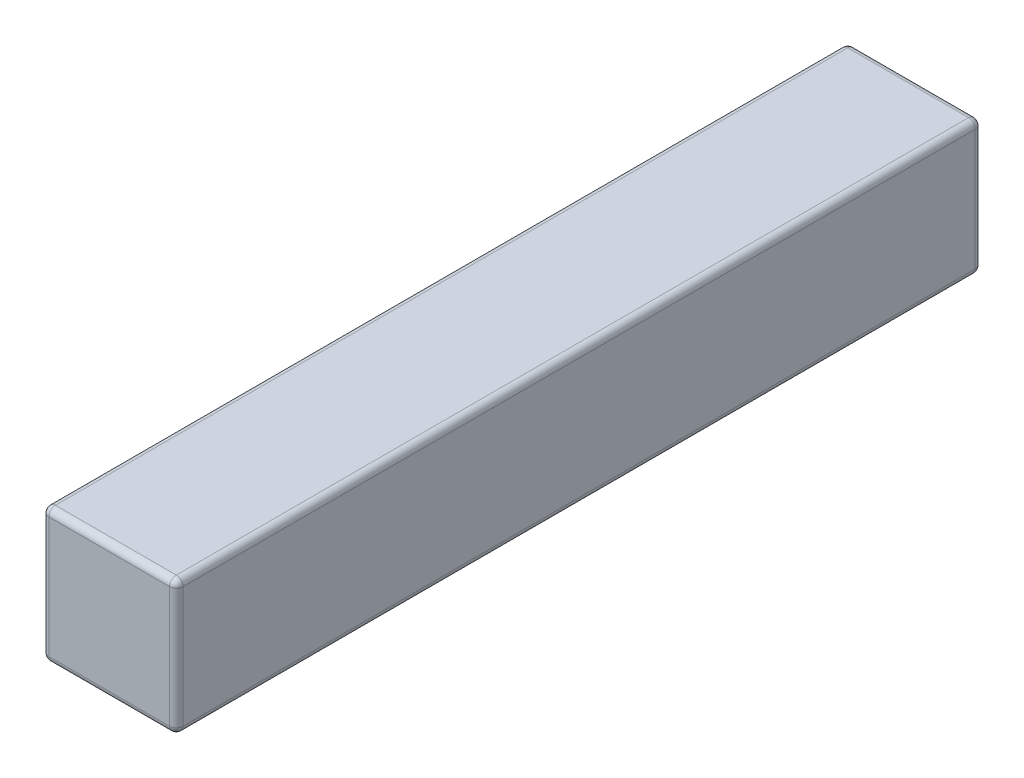
ISO-10303-21;
HEADER;
FILE_DESCRIPTION(('STEP AP214'),'2;1');
FILE_NAME('part.step','',(''),(''),'','','');
FILE_SCHEMA(('AUTOMOTIVE_DESIGN { 1 0 10303 214 1 1 1 1 }'));
ENDSEC;
DATA;
#1=APPLICATION_CONTEXT('core data for automotive mechanical design processes');
#2=APPLICATION_PROTOCOL_DEFINITION('international standard','automotive_design',2000,#1);
#3=PRODUCT_CONTEXT('',#1,'mechanical');
#4=PRODUCT('Part','Part','',(#3));
#5=PRODUCT_RELATED_PRODUCT_CATEGORY('part','',(#4));
#6=PRODUCT_DEFINITION_FORMATION('','',#4);
#7=PRODUCT_DEFINITION_CONTEXT('part definition',#1,'design');
#8=PRODUCT_DEFINITION('design','',#6,#7);
#9=PRODUCT_DEFINITION_SHAPE('','',#8);
#10=(LENGTH_UNIT() NAMED_UNIT(*) SI_UNIT(.MILLI.,.METRE.));
#11=(NAMED_UNIT(*) PLANE_ANGLE_UNIT() SI_UNIT($,.RADIAN.));
#12=(NAMED_UNIT(*) SI_UNIT($,.STERADIAN.) SOLID_ANGLE_UNIT());
#13=UNCERTAINTY_MEASURE_WITH_UNIT(LENGTH_MEASURE(1.E-05),#10,'distance_accuracy_value','');
#14=(GEOMETRIC_REPRESENTATION_CONTEXT(3) GLOBAL_UNCERTAINTY_ASSIGNED_CONTEXT((#13)) GLOBAL_UNIT_ASSIGNED_CONTEXT((#10,
#11,#12)) REPRESENTATION_CONTEXT('',''));
#15=CARTESIAN_POINT('',(0.,0.,0.));
#16=DIRECTION('',(0.,0.,1.));
#17=DIRECTION('',(1.,0.,0.));
#18=AXIS2_PLACEMENT_3D('',#15,#16,#17);
#19=CARTESIAN_POINT('',(0.,0.,304.8));
#20=DIRECTION('',(1.,0.,0.));
#21=DIRECTION('',(0.,0.,-1.));
#22=AXIS2_PLACEMENT_3D('',#19,#20,#21);
#23=PLANE('',#22);
#24=DIRECTION('',(0.,0.,-1.));
#25=VECTOR('',#24,1.);
#26=CARTESIAN_POINT('',(0.,48.26,304.8));
#27=LINE('',#26,#25);
#28=CARTESIAN_POINT('',(0.,48.26,302.26));
#29=VERTEX_POINT('',#28);
#30=CARTESIAN_POINT('',(0.,48.26,2.53999999999999));
#31=VERTEX_POINT('',#30);
#32=EDGE_CURVE('E383',#29,#31,#27,.T.);
#33=ORIENTED_EDGE('',*,*,#32,.T.);
#34=DIRECTION('',(0.,-1.,0.));
#35=VECTOR('',#34,1.);
#36=CARTESIAN_POINT('',(0.,0.,2.53999999999999));
#37=LINE('',#36,#35);
#38=CARTESIAN_POINT('',(0.,2.54,2.53999999999999));
#39=VERTEX_POINT('',#38);
#40=EDGE_CURVE('E389',#31,#39,#37,.T.);
#41=ORIENTED_EDGE('',*,*,#40,.T.);
#42=DIRECTION('',(0.,0.,-1.));
#43=VECTOR('',#42,1.);
#44=CARTESIAN_POINT('',(0.,2.54,304.8));
#45=LINE('',#44,#43);
#46=CARTESIAN_POINT('',(0.,2.54,302.26));
#47=VERTEX_POINT('',#46);
#48=EDGE_CURVE('E387',#39,#47,#45,.F.);
#49=ORIENTED_EDGE('',*,*,#48,.T.);
#50=DIRECTION('',(0.,-1.,0.));
#51=VECTOR('',#50,1.);
#52=CARTESIAN_POINT('',(0.,0.,302.26));
#53=LINE('',#52,#51);
#54=EDGE_CURVE('E385',#47,#29,#53,.F.);
#55=ORIENTED_EDGE('',*,*,#54,.T.);
#56=EDGE_LOOP('',(#33,#41,#49,#55));
#57=FACE_BOUND('',#56,.T.);
#58=ADVANCED_FACE('F35',(#57),#23,.F.);
#59=CARTESIAN_POINT('',(0.,0.,304.8));
#60=DIRECTION('',(0.,1.,0.));
#61=DIRECTION('',(0.,0.,1.));
#62=AXIS2_PLACEMENT_3D('',#59,#60,#61);
#63=PLANE('',#62);
#64=DIRECTION('',(0.,0.,-1.));
#65=VECTOR('',#64,1.);
#66=CARTESIAN_POINT('',(2.54,0.,304.8));
#67=LINE('',#66,#65);
#68=CARTESIAN_POINT('',(2.54,0.,302.26));
#69=VERTEX_POINT('',#68);
#70=CARTESIAN_POINT('',(2.54,0.,2.53999999999999));
#71=VERTEX_POINT('',#70);
#72=EDGE_CURVE('E378',#69,#71,#67,.T.);
#73=ORIENTED_EDGE('',*,*,#72,.T.);
#74=DIRECTION('',(1.,0.,0.));
#75=VECTOR('',#74,1.);
#76=CARTESIAN_POINT('',(50.8,0.,2.53999999999999));
#77=LINE('',#76,#75);
#78=CARTESIAN_POINT('',(48.26,0.,2.53999999999999));
#79=VERTEX_POINT('',#78);
#80=EDGE_CURVE('E380',#71,#79,#77,.T.);
#81=ORIENTED_EDGE('',*,*,#80,.T.);
#82=DIRECTION('',(0.,0.,-1.));
#83=VECTOR('',#82,1.);
#84=CARTESIAN_POINT('',(48.26,0.,304.8));
#85=LINE('',#84,#83);
#86=CARTESIAN_POINT('',(48.26,0.,302.26));
#87=VERTEX_POINT('',#86);
#88=EDGE_CURVE('E376',#79,#87,#85,.F.);
#89=ORIENTED_EDGE('',*,*,#88,.T.);
#90=DIRECTION('',(1.,0.,0.));
#91=VECTOR('',#90,1.);
#92=CARTESIAN_POINT('',(0.,0.,302.26));
#93=LINE('',#92,#91);
#94=EDGE_CURVE('E374',#87,#69,#93,.F.);
#95=ORIENTED_EDGE('',*,*,#94,.T.);
#96=EDGE_LOOP('',(#73,#81,#89,#95));
#97=FACE_BOUND('',#96,.T.);
#98=ADVANCED_FACE('F487',(#97),#63,.F.);
#99=CARTESIAN_POINT('',(50.8,0.,304.8));
#100=DIRECTION('',(-1.,0.,0.));
#101=DIRECTION('',(0.,0.,1.));
#102=AXIS2_PLACEMENT_3D('',#99,#100,#101);
#103=PLANE('',#102);
#104=DIRECTION('',(0.,0.,-1.));
#105=VECTOR('',#104,1.);
#106=CARTESIAN_POINT('',(50.8,2.54,304.8));
#107=LINE('',#106,#105);
#108=CARTESIAN_POINT('',(50.8,2.54,302.26));
#109=VERTEX_POINT('',#108);
#110=CARTESIAN_POINT('',(50.8,2.54,2.53999999999999));
#111=VERTEX_POINT('',#110);
#112=EDGE_CURVE('E360',#109,#111,#107,.T.);
#113=ORIENTED_EDGE('',*,*,#112,.T.);
#114=DIRECTION('',(0.,1.,0.));
#115=VECTOR('',#114,1.);
#116=CARTESIAN_POINT('',(50.8,50.8,2.53999999999999));
#117=LINE('',#116,#115);
#118=CARTESIAN_POINT('',(50.8,48.26,2.53999999999999));
#119=VERTEX_POINT('',#118);
#120=EDGE_CURVE('E362',#111,#119,#117,.T.);
#121=ORIENTED_EDGE('',*,*,#120,.T.);
#122=DIRECTION('',(0.,0.,-1.));
#123=VECTOR('',#122,1.);
#124=CARTESIAN_POINT('',(50.8,48.26,304.8));
#125=LINE('',#124,#123);
#126=CARTESIAN_POINT('',(50.8,48.26,302.26));
#127=VERTEX_POINT('',#126);
#128=EDGE_CURVE('E356',#119,#127,#125,.F.);
#129=ORIENTED_EDGE('',*,*,#128,.T.);
#130=DIRECTION('',(0.,1.,0.));
#131=VECTOR('',#130,1.);
#132=CARTESIAN_POINT('',(50.8,0.,302.26));
#133=LINE('',#132,#131);
#134=EDGE_CURVE('E358',#127,#109,#133,.F.);
#135=ORIENTED_EDGE('',*,*,#134,.T.);
#136=EDGE_LOOP('',(#113,#121,#129,#135));
#137=FACE_BOUND('',#136,.T.);
#138=ADVANCED_FACE('F574',(#137),#103,.F.);
#139=CARTESIAN_POINT('',(0.,50.8,304.8));
#140=DIRECTION('',(0.,-1.,0.));
#141=DIRECTION('',(0.,0.,-1.));
#142=AXIS2_PLACEMENT_3D('',#139,#140,#141);
#143=PLANE('',#142);
#144=DIRECTION('',(-1.,0.,0.));
#145=VECTOR('',#144,1.);
#146=CARTESIAN_POINT('',(0.,50.8,302.26));
#147=LINE('',#146,#145);
#148=CARTESIAN_POINT('',(2.54,50.8,302.26));
#149=VERTEX_POINT('',#148);
#150=CARTESIAN_POINT('',(48.26,50.8,302.26));
#151=VERTEX_POINT('',#150);
#152=EDGE_CURVE('E394',#149,#151,#147,.F.);
#153=ORIENTED_EDGE('',*,*,#152,.T.);
#154=DIRECTION('',(0.,0.,-1.));
#155=VECTOR('',#154,1.);
#156=CARTESIAN_POINT('',(48.26,50.8,304.8));
#157=LINE('',#156,#155);
#158=CARTESIAN_POINT('',(48.26,50.8,2.53999999999999));
#159=VERTEX_POINT('',#158);
#160=EDGE_CURVE('E399',#151,#159,#157,.T.);
#161=ORIENTED_EDGE('',*,*,#160,.T.);
#162=DIRECTION('',(-1.,0.,0.));
#163=VECTOR('',#162,1.);
#164=CARTESIAN_POINT('',(0.,50.8,2.53999999999999));
#165=LINE('',#164,#163);
#166=CARTESIAN_POINT('',(2.54,50.8,2.53999999999999));
#167=VERTEX_POINT('',#166);
#168=EDGE_CURVE('E396',#159,#167,#165,.T.);
#169=ORIENTED_EDGE('',*,*,#168,.T.);
#170=DIRECTION('',(0.,0.,-1.));
#171=VECTOR('',#170,1.);
#172=CARTESIAN_POINT('',(2.54,50.8,304.8));
#173=LINE('',#172,#171);
#174=EDGE_CURVE('E392',#167,#149,#173,.F.);
#175=ORIENTED_EDGE('',*,*,#174,.T.);
#176=EDGE_LOOP('',(#153,#161,#169,#175));
#177=FACE_BOUND('',#176,.T.);
#178=ADVANCED_FACE('F541',(#177),#143,.F.);
#179=CARTESIAN_POINT('',(0.,0.,304.8));
#180=DIRECTION('',(0.,0.,-1.));
#181=DIRECTION('',(-1.,0.,0.));
#182=AXIS2_PLACEMENT_3D('',#179,#180,#181);
#183=PLANE('',#182);
#184=DIRECTION('',(0.,-1.,0.));
#185=VECTOR('',#184,1.);
#186=CARTESIAN_POINT('',(2.54,0.,304.8));
#187=LINE('',#186,#185);
#188=CARTESIAN_POINT('',(2.54,48.26,304.8));
#189=VERTEX_POINT('',#188);
#190=CARTESIAN_POINT('',(2.54,2.54,304.8));
#191=VERTEX_POINT('',#190);
#192=EDGE_CURVE('E44',#189,#191,#187,.T.);
#193=ORIENTED_EDGE('',*,*,#192,.T.);
#194=DIRECTION('',(1.,0.,0.));
#195=VECTOR('',#194,1.);
#196=CARTESIAN_POINT('',(0.,2.54,304.8));
#197=LINE('',#196,#195);
#198=CARTESIAN_POINT('',(48.26,2.54,304.8));
#199=VERTEX_POINT('',#198);
#200=EDGE_CURVE('E11',#191,#199,#197,.T.);
#201=ORIENTED_EDGE('',*,*,#200,.T.);
#202=DIRECTION('',(0.,1.,0.));
#203=VECTOR('',#202,1.);
#204=CARTESIAN_POINT('',(48.26,0.,304.8));
#205=LINE('',#204,#203);
#206=CARTESIAN_POINT('',(48.26,48.26,304.8));
#207=VERTEX_POINT('',#206);
#208=EDGE_CURVE('E403',#199,#207,#205,.T.);
#209=ORIENTED_EDGE('',*,*,#208,.T.);
#210=DIRECTION('',(-1.,0.,0.));
#211=VECTOR('',#210,1.);
#212=CARTESIAN_POINT('',(0.,48.26,304.8));
#213=LINE('',#212,#211);
#214=EDGE_CURVE('E401',#207,#189,#213,.T.);
#215=ORIENTED_EDGE('',*,*,#214,.T.);
#216=EDGE_LOOP('',(#193,#201,#209,#215));
#217=FACE_BOUND('',#216,.T.);
#218=ADVANCED_FACE('F496',(#217),#183,.F.);
#219=CARTESIAN_POINT('',(0.,0.,0.));
#220=DIRECTION('',(0.,0.,-1.));
#221=DIRECTION('',(-1.,0.,0.));
#222=AXIS2_PLACEMENT_3D('',#219,#220,#221);
#223=PLANE('',#222);
#224=DIRECTION('',(0.,1.,0.));
#225=VECTOR('',#224,1.);
#226=CARTESIAN_POINT('',(12.9506355567735,22.650273980339,0.));
#227=LINE('',#226,#225);
#228=CARTESIAN_POINT('',(12.9506355567735,22.650273980339,0.));
#229=VERTEX_POINT('',#228);
#230=CARTESIAN_POINT('',(12.9506355567735,25.825273980339,0.));
#231=VERTEX_POINT('',#230);
#232=EDGE_CURVE('E251',#229,#231,#227,.T.);
#233=ORIENTED_EDGE('',*,*,#232,.T.);
#234=DIRECTION('',(-1.,0.,0.));
#235=VECTOR('',#234,1.);
#236=CARTESIAN_POINT('',(12.9506355567735,25.825273980339,0.));
#237=LINE('',#236,#235);
#238=CARTESIAN_POINT('',(6.35640478754276,25.825273980339,0.));
#239=VERTEX_POINT('',#238);
#240=EDGE_CURVE('E227',#231,#239,#237,.T.);
#241=ORIENTED_EDGE('',*,*,#240,.T.);
#242=DIRECTION('',(0.,-1.,0.));
#243=VECTOR('',#242,1.);
#244=CARTESIAN_POINT('',(6.35640478754276,25.825273980339,0.));
#245=LINE('',#244,#243);
#246=CARTESIAN_POINT('',(6.35640478754276,22.650273980339,0.));
#247=VERTEX_POINT('',#246);
#248=EDGE_CURVE('E57',#239,#247,#245,.T.);
#249=ORIENTED_EDGE('',*,*,#248,.T.);
#250=DIRECTION('',(1.,0.,0.));
#251=VECTOR('',#250,1.);
#252=CARTESIAN_POINT('',(6.35640478754276,22.650273980339,0.));
#253=LINE('',#252,#251);
#254=EDGE_CURVE('E52',#247,#229,#253,.T.);
#255=ORIENTED_EDGE('',*,*,#254,.T.);
#256=EDGE_LOOP('',(#233,#241,#249,#255));
#257=FACE_BOUND('',#256,.T.);
#258=DIRECTION('',(-1.,0.,0.));
#259=VECTOR('',#258,1.);
#260=CARTESIAN_POINT('',(44.212174018312,28.0233509034159,0.));
#261=LINE('',#260,#259);
#262=CARTESIAN_POINT('',(44.212174018312,28.0233509034159,0.));
#263=VERTEX_POINT('',#262);
#264=CARTESIAN_POINT('',(39.3275586336966,28.0233509034159,0.));
#265=VERTEX_POINT('',#264);
#266=EDGE_CURVE('E256',#263,#265,#261,.T.);
#267=ORIENTED_EDGE('',*,*,#266,.T.);
#268=DIRECTION('',(0.,1.,0.));
#269=VECTOR('',#268,1.);
#270=CARTESIAN_POINT('',(39.3275586336966,28.0233509034159,0.));
#271=LINE('',#270,#269);
#272=CARTESIAN_POINT('',(39.3275586336966,32.6637355188005,0.));
#273=VERTEX_POINT('',#272);
#274=EDGE_CURVE('E299',#265,#273,#271,.T.);
#275=ORIENTED_EDGE('',*,*,#274,.T.);
#276=DIRECTION('',(-1.,0.,0.));
#277=VECTOR('',#276,1.);
#278=CARTESIAN_POINT('',(39.3275586336966,32.6637355188005,0.));
#279=LINE('',#278,#277);
#280=CARTESIAN_POINT('',(36.1525586336966,32.6637355188005,0.));
#281=VERTEX_POINT('',#280);
#282=EDGE_CURVE('E301',#273,#281,#279,.T.);
#283=ORIENTED_EDGE('',*,*,#282,.T.);
#284=DIRECTION('',(0.,-1.,0.));
#285=VECTOR('',#284,1.);
#286=CARTESIAN_POINT('',(36.1525586336966,32.6637355188005,0.));
#287=LINE('',#286,#285);
#288=CARTESIAN_POINT('',(36.1525586336966,28.0233509034159,0.));
#289=VERTEX_POINT('',#288);
#290=EDGE_CURVE('E303',#281,#289,#287,.T.);
#291=ORIENTED_EDGE('',*,*,#290,.T.);
#292=DIRECTION('',(-1.,0.,0.));
#293=VECTOR('',#292,1.);
#294=CARTESIAN_POINT('',(36.1525586336966,28.0233509034159,0.));
#295=LINE('',#294,#293);
#296=CARTESIAN_POINT('',(31.2679432490812,28.0233509034159,0.));
#297=VERTEX_POINT('',#296);
#298=EDGE_CURVE('E305',#289,#297,#295,.T.);
#299=ORIENTED_EDGE('',*,*,#298,.T.);
#300=DIRECTION('',(0.,-1.,0.));
#301=VECTOR('',#300,1.);
#302=CARTESIAN_POINT('',(31.2679432490812,28.0233509034159,0.));
#303=LINE('',#302,#301);
#304=CARTESIAN_POINT('',(31.2679432490812,24.8483509034159,0.));
#305=VERTEX_POINT('',#304);
#306=EDGE_CURVE('E307',#297,#305,#303,.T.);
#307=ORIENTED_EDGE('',*,*,#306,.T.);
#308=DIRECTION('',(1.,0.,0.));
#309=VECTOR('',#308,1.);
#310=CARTESIAN_POINT('',(31.2679432490812,24.8483509034159,0.));
#311=LINE('',#310,#309);
#312=CARTESIAN_POINT('',(36.1525586336966,24.8483509034159,0.));
#313=VERTEX_POINT('',#312);
#314=EDGE_CURVE('E309',#305,#313,#311,.T.);
#315=ORIENTED_EDGE('',*,*,#314,.T.);
#316=DIRECTION('',(0.,-1.,0.));
#317=VECTOR('',#316,1.);
#318=CARTESIAN_POINT('',(36.1525586336966,24.8483509034159,0.));
#319=LINE('',#318,#317);
#320=CARTESIAN_POINT('',(36.1525586336966,20.2079662880313,0.));
#321=VERTEX_POINT('',#320);
#322=EDGE_CURVE('E311',#313,#321,#319,.T.);
#323=ORIENTED_EDGE('',*,*,#322,.T.);
#324=DIRECTION('',(1.,0.,0.));
#325=VECTOR('',#324,1.);
#326=CARTESIAN_POINT('',(36.1525586336966,20.2079662880313,0.));
#327=LINE('',#326,#325);
#328=CARTESIAN_POINT('',(39.3275586336966,20.2079662880313,0.));
#329=VERTEX_POINT('',#328);
#330=EDGE_CURVE('E313',#321,#329,#327,.T.);
#331=ORIENTED_EDGE('',*,*,#330,.T.);
#332=DIRECTION('',(0.,1.,0.));
#333=VECTOR('',#332,1.);
#334=CARTESIAN_POINT('',(39.3275586336966,20.2079662880313,0.));
#335=LINE('',#334,#333);
#336=CARTESIAN_POINT('',(39.3275586336966,24.8483509034159,0.));
#337=VERTEX_POINT('',#336);
#338=EDGE_CURVE('E315',#329,#337,#335,.T.);
#339=ORIENTED_EDGE('',*,*,#338,.T.);
#340=DIRECTION('',(1.,0.,0.));
#341=VECTOR('',#340,1.);
#342=CARTESIAN_POINT('',(39.3275586336966,24.8483509034159,0.));
#343=LINE('',#342,#341);
#344=CARTESIAN_POINT('',(44.212174018312,24.8483509034159,0.));
#345=VERTEX_POINT('',#344);
#346=EDGE_CURVE('E317',#337,#345,#343,.T.);
#347=ORIENTED_EDGE('',*,*,#346,.T.);
#348=DIRECTION('',(0.,1.,0.));
#349=VECTOR('',#348,1.);
#350=CARTESIAN_POINT('',(44.212174018312,24.8483509034159,0.));
#351=LINE('',#350,#349);
#352=EDGE_CURVE('E264',#345,#263,#351,.T.);
#353=ORIENTED_EDGE('',*,*,#352,.T.);
#354=EDGE_LOOP('',(#267,#275,#283,#291,#299,#307,#315,#323,#331,#339,#347,#353));
#355=FACE_BOUND('',#354,.T.);
#356=DIRECTION('',(-1.,0.,0.));
#357=VECTOR('',#356,1.);
#358=CARTESIAN_POINT('',(50.8,48.26,0.));
#359=LINE('',#358,#357);
#360=CARTESIAN_POINT('',(2.54,48.26,0.));
#361=VERTEX_POINT('',#360);
#362=CARTESIAN_POINT('',(48.26,48.26,0.));
#363=VERTEX_POINT('',#362);
#364=EDGE_CURVE('E365',#361,#363,#359,.F.);
#365=ORIENTED_EDGE('',*,*,#364,.T.);
#366=DIRECTION('',(0.,1.,0.));
#367=VECTOR('',#366,1.);
#368=CARTESIAN_POINT('',(48.26,0.,0.));
#369=LINE('',#368,#367);
#370=CARTESIAN_POINT('',(48.26,2.54,0.));
#371=VERTEX_POINT('',#370);
#372=EDGE_CURVE('E371',#363,#371,#369,.F.);
#373=ORIENTED_EDGE('',*,*,#372,.T.);
#374=DIRECTION('',(1.,0.,0.));
#375=VECTOR('',#374,1.);
#376=CARTESIAN_POINT('',(0.,2.54,0.));
#377=LINE('',#376,#375);
#378=CARTESIAN_POINT('',(2.54,2.54,0.));
#379=VERTEX_POINT('',#378);
#380=EDGE_CURVE('E369',#371,#379,#377,.F.);
#381=ORIENTED_EDGE('',*,*,#380,.T.);
#382=DIRECTION('',(0.,-1.,0.));
#383=VECTOR('',#382,1.);
#384=CARTESIAN_POINT('',(2.54,50.8,0.));
#385=LINE('',#384,#383);
#386=EDGE_CURVE('E367',#379,#361,#385,.F.);
#387=ORIENTED_EDGE('',*,*,#386,.T.);
#388=EDGE_LOOP('',(#365,#373,#381,#387));
#389=FACE_BOUND('',#388,.T.);
#390=ADVANCED_FACE('F559',(#257,#355,#389),#223,.T.);
#391=CARTESIAN_POINT('',(2.54,0.,302.26));
#392=DIRECTION('',(0.,-1.,0.));
#393=DIRECTION('',(0.,0.,-1.));
#394=AXIS2_PLACEMENT_3D('',#391,#392,#393);
#395=CYLINDRICAL_SURFACE('',#394,2.54);
#396=CARTESIAN_POINT('',(2.54,2.54,302.26));
#397=DIRECTION('',(0.,-1.,0.));
#398=DIRECTION('',(0.,0.,-1.));
#399=AXIS2_PLACEMENT_3D('',#396,#397,#398);
#400=CIRCLE('',#399,2.54);
#401=EDGE_CURVE('E39',#191,#47,#400,.T.);
#402=ORIENTED_EDGE('',*,*,#401,.F.);
#403=ORIENTED_EDGE('',*,*,#192,.F.);
#404=CARTESIAN_POINT('',(2.54,48.26,302.26));
#405=DIRECTION('',(0.,1.,0.));
#406=DIRECTION('',(0.,0.,1.));
#407=AXIS2_PLACEMENT_3D('',#404,#405,#406);
#408=CIRCLE('',#407,2.54);
#409=EDGE_CURVE('E464',#29,#189,#408,.T.);
#410=ORIENTED_EDGE('',*,*,#409,.F.);
#411=ORIENTED_EDGE('',*,*,#54,.F.);
#412=EDGE_LOOP('',(#402,#403,#410,#411));
#413=FACE_BOUND('',#412,.T.);
#414=ADVANCED_FACE('F37',(#413),#395,.T.);
#415=CARTESIAN_POINT('',(2.54,2.54,302.26));
#416=DIRECTION('',(-1.,0.,0.));
#417=DIRECTION('',(0.,0.,1.));
#418=AXIS2_PLACEMENT_3D('',#415,#416,#417);
#419=SPHERICAL_SURFACE('',#418,2.54);
#420=CARTESIAN_POINT('',(2.54,2.54,302.26));
#421=DIRECTION('',(-1.,0.,0.));
#422=DIRECTION('',(0.,0.,1.));
#423=AXIS2_PLACEMENT_3D('',#420,#421,#422);
#424=CIRCLE('',#423,2.54);
#425=EDGE_CURVE('E459',#191,#69,#424,.F.);
#426=ORIENTED_EDGE('',*,*,#425,.F.);
#427=ORIENTED_EDGE('',*,*,#401,.T.);
#428=CARTESIAN_POINT('',(2.54,2.54,302.26));
#429=DIRECTION('',(0.,0.,1.));
#430=DIRECTION('',(1.,0.,0.));
#431=AXIS2_PLACEMENT_3D('',#428,#429,#430);
#432=CIRCLE('',#431,2.54);
#433=EDGE_CURVE('E462',#69,#47,#432,.F.);
#434=ORIENTED_EDGE('',*,*,#433,.F.);
#435=EDGE_LOOP('',(#426,#427,#434));
#436=FACE_BOUND('',#435,.T.);
#437=ADVANCED_FACE('F475',(#436),#419,.T.);
#438=CARTESIAN_POINT('',(2.54,48.26,302.26));
#439=DIRECTION('',(0.,0.,1.));
#440=DIRECTION('',(1.,0.,0.));
#441=AXIS2_PLACEMENT_3D('',#438,#439,#440);
#442=SPHERICAL_SURFACE('',#441,2.54);
#443=CARTESIAN_POINT('',(2.54,48.26,302.26));
#444=DIRECTION('',(0.,0.,1.));
#445=DIRECTION('',(1.,0.,0.));
#446=AXIS2_PLACEMENT_3D('',#443,#444,#445);
#447=CIRCLE('',#446,2.54);
#448=EDGE_CURVE('E453',#29,#149,#447,.F.);
#449=ORIENTED_EDGE('',*,*,#448,.F.);
#450=ORIENTED_EDGE('',*,*,#409,.T.);
#451=CARTESIAN_POINT('',(2.54,48.26,302.26));
#452=DIRECTION('',(-1.,0.,0.));
#453=DIRECTION('',(0.,0.,1.));
#454=AXIS2_PLACEMENT_3D('',#451,#452,#453);
#455=CIRCLE('',#454,2.54);
#456=EDGE_CURVE('E456',#149,#189,#455,.F.);
#457=ORIENTED_EDGE('',*,*,#456,.F.);
#458=EDGE_LOOP('',(#449,#450,#457));
#459=FACE_BOUND('',#458,.T.);
#460=ADVANCED_FACE('F499',(#459),#442,.T.);
#461=CARTESIAN_POINT('',(2.54,2.54,304.8));
#462=DIRECTION('',(0.,0.,-1.));
#463=DIRECTION('',(-1.,0.,0.));
#464=AXIS2_PLACEMENT_3D('',#461,#462,#463);
#465=CYLINDRICAL_SURFACE('',#464,2.54);
#466=ORIENTED_EDGE('',*,*,#433,.T.);
#467=ORIENTED_EDGE('',*,*,#48,.F.);
#468=CARTESIAN_POINT('',(2.54,2.54,2.53999999999999));
#469=DIRECTION('',(0.,0.,-1.));
#470=DIRECTION('',(-1.,0.,0.));
#471=AXIS2_PLACEMENT_3D('',#468,#469,#470);
#472=CIRCLE('',#471,2.54);
#473=EDGE_CURVE('E448',#71,#39,#472,.T.);
#474=ORIENTED_EDGE('',*,*,#473,.F.);
#475=ORIENTED_EDGE('',*,*,#72,.F.);
#476=EDGE_LOOP('',(#466,#467,#474,#475));
#477=FACE_BOUND('',#476,.T.);
#478=ADVANCED_FACE('F483',(#477),#465,.T.);
#479=CARTESIAN_POINT('',(0.,2.54,302.26));
#480=DIRECTION('',(1.,0.,0.));
#481=DIRECTION('',(0.,0.,-1.));
#482=AXIS2_PLACEMENT_3D('',#479,#480,#481);
#483=CYLINDRICAL_SURFACE('',#482,2.54);
#484=ORIENTED_EDGE('',*,*,#425,.T.);
#485=ORIENTED_EDGE('',*,*,#94,.F.);
#486=CARTESIAN_POINT('',(48.26,2.54,302.26));
#487=DIRECTION('',(1.,0.,0.));
#488=DIRECTION('',(0.,0.,-1.));
#489=AXIS2_PLACEMENT_3D('',#486,#487,#488);
#490=CIRCLE('',#489,2.54);
#491=EDGE_CURVE('E445',#199,#87,#490,.T.);
#492=ORIENTED_EDGE('',*,*,#491,.F.);
#493=ORIENTED_EDGE('',*,*,#200,.F.);
#494=EDGE_LOOP('',(#484,#485,#492,#493));
#495=FACE_BOUND('',#494,.T.);
#496=ADVANCED_FACE('F493',(#495),#483,.T.);
#497=CARTESIAN_POINT('',(48.26,0.,302.26));
#498=DIRECTION('',(0.,1.,0.));
#499=DIRECTION('',(0.,0.,1.));
#500=AXIS2_PLACEMENT_3D('',#497,#498,#499);
#501=CYLINDRICAL_SURFACE('',#500,2.54);
#502=CARTESIAN_POINT('',(48.26,48.26,302.26));
#503=DIRECTION('',(0.,1.,0.));
#504=DIRECTION('',(0.,0.,1.));
#505=AXIS2_PLACEMENT_3D('',#502,#503,#504);
#506=CIRCLE('',#505,2.54);
#507=EDGE_CURVE('E440',#207,#127,#506,.T.);
#508=ORIENTED_EDGE('',*,*,#507,.F.);
#509=ORIENTED_EDGE('',*,*,#208,.F.);
#510=CARTESIAN_POINT('',(48.26,2.54,302.26));
#511=DIRECTION('',(0.,-1.,0.));
#512=DIRECTION('',(0.,0.,-1.));
#513=AXIS2_PLACEMENT_3D('',#510,#511,#512);
#514=CIRCLE('',#513,2.54);
#515=EDGE_CURVE('E443',#109,#199,#514,.T.);
#516=ORIENTED_EDGE('',*,*,#515,.F.);
#517=ORIENTED_EDGE('',*,*,#134,.F.);
#518=EDGE_LOOP('',(#508,#509,#516,#517));
#519=FACE_BOUND('',#518,.T.);
#520=ADVANCED_FACE('F532',(#519),#501,.T.);
#521=CARTESIAN_POINT('',(0.,48.26,302.26));
#522=DIRECTION('',(-1.,0.,0.));
#523=DIRECTION('',(0.,0.,1.));
#524=AXIS2_PLACEMENT_3D('',#521,#522,#523);
#525=CYLINDRICAL_SURFACE('',#524,2.54);
#526=ORIENTED_EDGE('',*,*,#456,.T.);
#527=ORIENTED_EDGE('',*,*,#214,.F.);
#528=CARTESIAN_POINT('',(48.26,48.26,302.26));
#529=DIRECTION('',(1.,0.,0.));
#530=DIRECTION('',(0.,0.,-1.));
#531=AXIS2_PLACEMENT_3D('',#528,#529,#530);
#532=CIRCLE('',#531,2.54);
#533=EDGE_CURVE('E437',#151,#207,#532,.T.);
#534=ORIENTED_EDGE('',*,*,#533,.F.);
#535=ORIENTED_EDGE('',*,*,#152,.F.);
#536=EDGE_LOOP('',(#526,#527,#534,#535));
#537=FACE_BOUND('',#536,.T.);
#538=ADVANCED_FACE('F539',(#537),#525,.T.);
#539=CARTESIAN_POINT('',(2.54,48.26,304.8));
#540=DIRECTION('',(0.,0.,-1.));
#541=DIRECTION('',(-1.,0.,0.));
#542=AXIS2_PLACEMENT_3D('',#539,#540,#541);
#543=CYLINDRICAL_SURFACE('',#542,2.54);
#544=ORIENTED_EDGE('',*,*,#448,.T.);
#545=ORIENTED_EDGE('',*,*,#174,.F.);
#546=CARTESIAN_POINT('',(2.54,48.26,2.53999999999999));
#547=DIRECTION('',(0.,0.,-1.));
#548=DIRECTION('',(-1.,0.,0.));
#549=AXIS2_PLACEMENT_3D('',#546,#547,#548);
#550=CIRCLE('',#549,2.54);
#551=EDGE_CURVE('E434',#31,#167,#550,.T.);
#552=ORIENTED_EDGE('',*,*,#551,.F.);
#553=ORIENTED_EDGE('',*,*,#32,.F.);
#554=EDGE_LOOP('',(#544,#545,#552,#553));
#555=FACE_BOUND('',#554,.T.);
#556=ADVANCED_FACE('F504',(#555),#543,.T.);
#557=CARTESIAN_POINT('',(2.54,0.,2.53999999999999));
#558=DIRECTION('',(0.,1.,0.));
#559=DIRECTION('',(0.,0.,1.));
#560=AXIS2_PLACEMENT_3D('',#557,#558,#559);
#561=CYLINDRICAL_SURFACE('',#560,2.54);
#562=CARTESIAN_POINT('',(2.54,2.54,2.53999999999999));
#563=DIRECTION('',(0.,-1.,0.));
#564=DIRECTION('',(0.,0.,-1.));
#565=AXIS2_PLACEMENT_3D('',#562,#563,#564);
#566=CIRCLE('',#565,2.54);
#567=EDGE_CURVE('E450',#39,#379,#566,.T.);
#568=ORIENTED_EDGE('',*,*,#567,.F.);
#569=ORIENTED_EDGE('',*,*,#40,.F.);
#570=CARTESIAN_POINT('',(2.54,48.26,2.54));
#571=DIRECTION('',(0.,1.,0.));
#572=DIRECTION('',(0.,0.,1.));
#573=AXIS2_PLACEMENT_3D('',#570,#571,#572);
#574=CIRCLE('',#573,2.54);
#575=EDGE_CURVE('E431',#361,#31,#574,.T.);
#576=ORIENTED_EDGE('',*,*,#575,.F.);
#577=ORIENTED_EDGE('',*,*,#386,.F.);
#578=EDGE_LOOP('',(#568,#569,#576,#577));
#579=FACE_BOUND('',#578,.T.);
#580=ADVANCED_FACE('F510',(#579),#561,.T.);
#581=CARTESIAN_POINT('',(2.54,2.54,2.54));
#582=DIRECTION('',(-1.,0.,0.));
#583=DIRECTION('',(0.,0.,1.));
#584=AXIS2_PLACEMENT_3D('',#581,#582,#583);
#585=SPHERICAL_SURFACE('',#584,2.54);
#586=ORIENTED_EDGE('',*,*,#473,.T.);
#587=ORIENTED_EDGE('',*,*,#567,.T.);
#588=CARTESIAN_POINT('',(2.54,2.54,2.54));
#589=DIRECTION('',(-1.,0.,0.));
#590=DIRECTION('',(0.,-1.,0.));
#591=AXIS2_PLACEMENT_3D('',#588,#589,#590);
#592=CIRCLE('',#591,2.54);
#593=EDGE_CURVE('E428',#71,#379,#592,.F.);
#594=ORIENTED_EDGE('',*,*,#593,.F.);
#595=EDGE_LOOP('',(#586,#587,#594));
#596=FACE_BOUND('',#595,.T.);
#597=ADVANCED_FACE('F514',(#596),#585,.T.);
#598=CARTESIAN_POINT('',(48.26,2.54,302.26));
#599=DIRECTION('',(0.,0.,1.));
#600=DIRECTION('',(1.,0.,0.));
#601=AXIS2_PLACEMENT_3D('',#598,#599,#600);
#602=SPHERICAL_SURFACE('',#601,2.54);
#603=ORIENTED_EDGE('',*,*,#515,.T.);
#604=ORIENTED_EDGE('',*,*,#491,.T.);
#605=CARTESIAN_POINT('',(48.26,2.54,302.26));
#606=DIRECTION('',(0.,0.,1.));
#607=DIRECTION('',(1.,0.,0.));
#608=AXIS2_PLACEMENT_3D('',#605,#606,#607);
#609=CIRCLE('',#608,2.54);
#610=EDGE_CURVE('E425',#109,#87,#609,.F.);
#611=ORIENTED_EDGE('',*,*,#610,.F.);
#612=EDGE_LOOP('',(#603,#604,#611));
#613=FACE_BOUND('',#612,.T.);
#614=ADVANCED_FACE('F527',(#613),#602,.T.);
#615=CARTESIAN_POINT('',(48.26,48.26,302.26));
#616=DIRECTION('',(0.,0.,1.));
#617=DIRECTION('',(1.,0.,0.));
#618=AXIS2_PLACEMENT_3D('',#615,#616,#617);
#619=SPHERICAL_SURFACE('',#618,2.54);
#620=ORIENTED_EDGE('',*,*,#533,.T.);
#621=ORIENTED_EDGE('',*,*,#507,.T.);
#622=CARTESIAN_POINT('',(48.26,48.26,302.26));
#623=DIRECTION('',(0.,0.,1.));
#624=DIRECTION('',(1.,0.,0.));
#625=AXIS2_PLACEMENT_3D('',#622,#623,#624);
#626=CIRCLE('',#625,2.54);
#627=EDGE_CURVE('E422',#151,#127,#626,.F.);
#628=ORIENTED_EDGE('',*,*,#627,.F.);
#629=EDGE_LOOP('',(#620,#621,#628));
#630=FACE_BOUND('',#629,.T.);
#631=ADVANCED_FACE('F536',(#630),#619,.T.);
#632=CARTESIAN_POINT('',(2.54,48.26,2.54));
#633=DIRECTION('',(-1.,0.,0.));
#634=DIRECTION('',(0.,0.,1.));
#635=AXIS2_PLACEMENT_3D('',#632,#633,#634);
#636=SPHERICAL_SURFACE('',#635,2.54);
#637=ORIENTED_EDGE('',*,*,#575,.T.);
#638=ORIENTED_EDGE('',*,*,#551,.T.);
#639=CARTESIAN_POINT('',(2.54,48.26,2.53999999999999));
#640=DIRECTION('',(-1.,0.,0.));
#641=DIRECTION('',(0.,0.,1.));
#642=AXIS2_PLACEMENT_3D('',#639,#640,#641);
#643=CIRCLE('',#642,2.54);
#644=EDGE_CURVE('E420',#361,#167,#643,.F.);
#645=ORIENTED_EDGE('',*,*,#644,.F.);
#646=EDGE_LOOP('',(#637,#638,#645));
#647=FACE_BOUND('',#646,.T.);
#648=ADVANCED_FACE('F594',(#647),#636,.T.);
#649=CARTESIAN_POINT('',(0.,2.54,2.53999999999999));
#650=DIRECTION('',(-1.,0.,0.));
#651=DIRECTION('',(0.,0.,1.));
#652=AXIS2_PLACEMENT_3D('',#649,#650,#651);
#653=CYLINDRICAL_SURFACE('',#652,2.54);
#654=ORIENTED_EDGE('',*,*,#593,.T.);
#655=ORIENTED_EDGE('',*,*,#380,.F.);
#656=CARTESIAN_POINT('',(48.26,2.54,2.53999999999999));
#657=DIRECTION('',(1.,0.,0.));
#658=DIRECTION('',(0.,0.,-1.));
#659=AXIS2_PLACEMENT_3D('',#656,#657,#658);
#660=CIRCLE('',#659,2.54);
#661=EDGE_CURVE('E417',#79,#371,#660,.T.);
#662=ORIENTED_EDGE('',*,*,#661,.F.);
#663=ORIENTED_EDGE('',*,*,#80,.F.);
#664=EDGE_LOOP('',(#654,#655,#662,#663));
#665=FACE_BOUND('',#664,.T.);
#666=ADVANCED_FACE('F517',(#665),#653,.T.);
#667=CARTESIAN_POINT('',(48.26,2.54,304.8));
#668=DIRECTION('',(0.,0.,-1.));
#669=DIRECTION('',(-1.,0.,0.));
#670=AXIS2_PLACEMENT_3D('',#667,#668,#669);
#671=CYLINDRICAL_SURFACE('',#670,2.54);
#672=ORIENTED_EDGE('',*,*,#610,.T.);
#673=ORIENTED_EDGE('',*,*,#88,.F.);
#674=CARTESIAN_POINT('',(48.26,2.54,2.53999999999999));
#675=DIRECTION('',(0.,0.,-1.));
#676=DIRECTION('',(-1.,0.,0.));
#677=AXIS2_PLACEMENT_3D('',#674,#675,#676);
#678=CIRCLE('',#677,2.54);
#679=EDGE_CURVE('E415',#111,#79,#678,.T.);
#680=ORIENTED_EDGE('',*,*,#679,.F.);
#681=ORIENTED_EDGE('',*,*,#112,.F.);
#682=EDGE_LOOP('',(#672,#673,#680,#681));
#683=FACE_BOUND('',#682,.T.);
#684=ADVANCED_FACE('F523',(#683),#671,.T.);
#685=CARTESIAN_POINT('',(48.26,48.26,304.8));
#686=DIRECTION('',(0.,0.,-1.));
#687=DIRECTION('',(-1.,0.,0.));
#688=AXIS2_PLACEMENT_3D('',#685,#686,#687);
#689=CYLINDRICAL_SURFACE('',#688,2.54);
#690=ORIENTED_EDGE('',*,*,#627,.T.);
#691=ORIENTED_EDGE('',*,*,#128,.F.);
#692=CARTESIAN_POINT('',(48.26,48.26,2.53999999999999));
#693=DIRECTION('',(0.,0.,-1.));
#694=DIRECTION('',(-1.,0.,0.));
#695=AXIS2_PLACEMENT_3D('',#692,#693,#694);
#696=CIRCLE('',#695,2.54);
#697=EDGE_CURVE('E412',#159,#119,#696,.T.);
#698=ORIENTED_EDGE('',*,*,#697,.F.);
#699=ORIENTED_EDGE('',*,*,#160,.F.);
#700=EDGE_LOOP('',(#690,#691,#698,#699));
#701=FACE_BOUND('',#700,.T.);
#702=ADVANCED_FACE('F551',(#701),#689,.T.);
#703=CARTESIAN_POINT('',(0.,48.26,2.53999999999999));
#704=DIRECTION('',(1.,0.,0.));
#705=DIRECTION('',(0.,0.,-1.));
#706=AXIS2_PLACEMENT_3D('',#703,#704,#705);
#707=CYLINDRICAL_SURFACE('',#706,2.54);
#708=ORIENTED_EDGE('',*,*,#644,.T.);
#709=ORIENTED_EDGE('',*,*,#168,.F.);
#710=CARTESIAN_POINT('',(48.26,48.26,2.54));
#711=DIRECTION('',(1.,0.,0.));
#712=DIRECTION('',(0.,0.,-1.));
#713=AXIS2_PLACEMENT_3D('',#710,#711,#712);
#714=CIRCLE('',#713,2.54);
#715=EDGE_CURVE('E409',#363,#159,#714,.T.);
#716=ORIENTED_EDGE('',*,*,#715,.F.);
#717=ORIENTED_EDGE('',*,*,#364,.F.);
#718=EDGE_LOOP('',(#708,#709,#716,#717));
#719=FACE_BOUND('',#718,.T.);
#720=ADVANCED_FACE('F546',(#719),#707,.T.);
#721=CARTESIAN_POINT('',(48.26,2.54,2.54));
#722=DIRECTION('',(0.,-1.,0.));
#723=DIRECTION('',(0.,0.,-1.));
#724=AXIS2_PLACEMENT_3D('',#721,#722,#723);
#725=SPHERICAL_SURFACE('',#724,2.54);
#726=ORIENTED_EDGE('',*,*,#679,.T.);
#727=ORIENTED_EDGE('',*,*,#661,.T.);
#728=CARTESIAN_POINT('',(48.26,2.54,2.54));
#729=DIRECTION('',(0.,-1.,0.));
#730=DIRECTION('',(1.,0.,0.));
#731=AXIS2_PLACEMENT_3D('',#728,#729,#730);
#732=CIRCLE('',#731,2.54);
#733=EDGE_CURVE('E407',#111,#371,#732,.F.);
#734=ORIENTED_EDGE('',*,*,#733,.F.);
#735=EDGE_LOOP('',(#726,#727,#734));
#736=FACE_BOUND('',#735,.T.);
#737=ADVANCED_FACE('F583',(#736),#725,.T.);
#738=CARTESIAN_POINT('',(48.26,48.26,2.54));
#739=DIRECTION('',(0.,1.,0.));
#740=DIRECTION('',(0.,0.,1.));
#741=AXIS2_PLACEMENT_3D('',#738,#739,#740);
#742=SPHERICAL_SURFACE('',#741,2.54);
#743=ORIENTED_EDGE('',*,*,#715,.T.);
#744=ORIENTED_EDGE('',*,*,#697,.T.);
#745=CARTESIAN_POINT('',(48.26,48.26,2.53999999999999));
#746=DIRECTION('',(0.,1.,0.));
#747=DIRECTION('',(0.,0.,1.));
#748=AXIS2_PLACEMENT_3D('',#745,#746,#747);
#749=CIRCLE('',#748,2.54);
#750=EDGE_CURVE('E323',#363,#119,#749,.F.);
#751=ORIENTED_EDGE('',*,*,#750,.F.);
#752=EDGE_LOOP('',(#743,#744,#751));
#753=FACE_BOUND('',#752,.T.);
#754=ADVANCED_FACE('F554',(#753),#742,.T.);
#755=CARTESIAN_POINT('',(48.26,0.,2.53999999999999));
#756=DIRECTION('',(0.,-1.,0.));
#757=DIRECTION('',(0.,0.,-1.));
#758=AXIS2_PLACEMENT_3D('',#755,#756,#757);
#759=CYLINDRICAL_SURFACE('',#758,2.54);
#760=ORIENTED_EDGE('',*,*,#733,.T.);
#761=ORIENTED_EDGE('',*,*,#372,.F.);
#762=ORIENTED_EDGE('',*,*,#750,.T.);
#763=ORIENTED_EDGE('',*,*,#120,.F.);
#764=EDGE_LOOP('',(#760,#761,#762,#763));
#765=FACE_BOUND('',#764,.T.);
#766=ADVANCED_FACE('F557',(#765),#759,.T.);
#767=CARTESIAN_POINT('',(44.212174018312,28.0233509034159,-1.27));
#768=DIRECTION('',(0.,1.,0.));
#769=DIRECTION('',(0.,0.,1.));
#770=AXIS2_PLACEMENT_3D('',#767,#768,#769);
#771=PLANE('',#770);
#772=ORIENTED_EDGE('',*,*,#266,.F.);
#773=DIRECTION('',(0.,0.,1.));
#774=VECTOR('',#773,1.);
#775=CARTESIAN_POINT('',(44.212174018312,28.0233509034159,-1.27));
#776=LINE('',#775,#774);
#777=CARTESIAN_POINT('',(44.212174018312,28.0233509034159,-1.27));
#778=VERTEX_POINT('',#777);
#779=EDGE_CURVE('E320',#778,#263,#776,.T.);
#780=ORIENTED_EDGE('',*,*,#779,.F.);
#781=DIRECTION('',(-1.,0.,0.));
#782=VECTOR('',#781,1.);
#783=CARTESIAN_POINT('',(44.212174018312,28.0233509034159,-1.27));
#784=LINE('',#783,#782);
#785=CARTESIAN_POINT('',(39.3275586336966,28.0233509034159,-1.27));
#786=VERTEX_POINT('',#785);
#787=EDGE_CURVE('E260',#778,#786,#784,.T.);
#788=ORIENTED_EDGE('',*,*,#787,.T.);
#789=DIRECTION('',(0.,0.,1.));
#790=VECTOR('',#789,1.);
#791=CARTESIAN_POINT('',(39.3275586336966,28.0233509034159,-1.27));
#792=LINE('',#791,#790);
#793=EDGE_CURVE('E297',#786,#265,#792,.T.);
#794=ORIENTED_EDGE('',*,*,#793,.T.);
#795=EDGE_LOOP('',(#772,#780,#788,#794));
#796=FACE_BOUND('',#795,.T.);
#797=ADVANCED_FACE('F580',(#796),#771,.T.);
#798=CARTESIAN_POINT('',(44.212174018312,24.8483509034159,-1.27));
#799=DIRECTION('',(1.,0.,0.));
#800=DIRECTION('',(0.,0.,-1.));
#801=AXIS2_PLACEMENT_3D('',#798,#799,#800);
#802=PLANE('',#801);
#803=ORIENTED_EDGE('',*,*,#352,.F.);
#804=DIRECTION('',(0.,0.,1.));
#805=VECTOR('',#804,1.);
#806=CARTESIAN_POINT('',(44.212174018312,24.8483509034159,-1.27));
#807=LINE('',#806,#805);
#808=CARTESIAN_POINT('',(44.212174018312,24.8483509034159,-1.27));
#809=VERTEX_POINT('',#808);
#810=EDGE_CURVE('E324',#809,#345,#807,.T.);
#811=ORIENTED_EDGE('',*,*,#810,.F.);
#812=DIRECTION('',(0.,1.,0.));
#813=VECTOR('',#812,1.);
#814=CARTESIAN_POINT('',(44.212174018312,24.8483509034159,-1.27));
#815=LINE('',#814,#813);
#816=EDGE_CURVE('E294',#809,#778,#815,.T.);
#817=ORIENTED_EDGE('',*,*,#816,.T.);
#818=ORIENTED_EDGE('',*,*,#779,.T.);
#819=EDGE_LOOP('',(#803,#811,#817,#818));
#820=FACE_BOUND('',#819,.T.);
#821=ADVANCED_FACE('F700',(#820),#802,.T.);
#822=CARTESIAN_POINT('',(39.3275586336966,24.8483509034159,-1.27));
#823=DIRECTION('',(0.,-1.,0.));
#824=DIRECTION('',(0.,0.,-1.));
#825=AXIS2_PLACEMENT_3D('',#822,#823,#824);
#826=PLANE('',#825);
#827=ORIENTED_EDGE('',*,*,#346,.F.);
#828=DIRECTION('',(0.,0.,1.));
#829=VECTOR('',#828,1.);
#830=CARTESIAN_POINT('',(39.3275586336966,24.8483509034159,-1.27));
#831=LINE('',#830,#829);
#832=CARTESIAN_POINT('',(39.3275586336966,24.8483509034159,-1.27));
#833=VERTEX_POINT('',#832);
#834=EDGE_CURVE('E327',#833,#337,#831,.T.);
#835=ORIENTED_EDGE('',*,*,#834,.F.);
#836=DIRECTION('',(1.,0.,0.));
#837=VECTOR('',#836,1.);
#838=CARTESIAN_POINT('',(39.3275586336966,24.8483509034159,-1.27));
#839=LINE('',#838,#837);
#840=EDGE_CURVE('E291',#833,#809,#839,.T.);
#841=ORIENTED_EDGE('',*,*,#840,.T.);
#842=ORIENTED_EDGE('',*,*,#810,.T.);
#843=EDGE_LOOP('',(#827,#835,#841,#842));
#844=FACE_BOUND('',#843,.T.);
#845=ADVANCED_FACE('F708',(#844),#826,.T.);
#846=CARTESIAN_POINT('',(39.3275586336966,20.2079662880313,-1.27));
#847=DIRECTION('',(1.,0.,0.));
#848=DIRECTION('',(0.,0.,-1.));
#849=AXIS2_PLACEMENT_3D('',#846,#847,#848);
#850=PLANE('',#849);
#851=ORIENTED_EDGE('',*,*,#338,.F.);
#852=DIRECTION('',(0.,0.,1.));
#853=VECTOR('',#852,1.);
#854=CARTESIAN_POINT('',(39.3275586336966,20.2079662880313,-1.27));
#855=LINE('',#854,#853);
#856=CARTESIAN_POINT('',(39.3275586336966,20.2079662880313,-1.27));
#857=VERTEX_POINT('',#856);
#858=EDGE_CURVE('E330',#857,#329,#855,.T.);
#859=ORIENTED_EDGE('',*,*,#858,.F.);
#860=DIRECTION('',(0.,1.,0.));
#861=VECTOR('',#860,1.);
#862=CARTESIAN_POINT('',(39.3275586336966,20.2079662880313,-1.27));
#863=LINE('',#862,#861);
#864=EDGE_CURVE('E288',#857,#833,#863,.T.);
#865=ORIENTED_EDGE('',*,*,#864,.T.);
#866=ORIENTED_EDGE('',*,*,#834,.T.);
#867=EDGE_LOOP('',(#851,#859,#865,#866));
#868=FACE_BOUND('',#867,.T.);
#869=ADVANCED_FACE('F716',(#868),#850,.T.);
#870=CARTESIAN_POINT('',(36.1525586336966,20.2079662880313,-1.27));
#871=DIRECTION('',(0.,-1.,0.));
#872=DIRECTION('',(0.,0.,-1.));
#873=AXIS2_PLACEMENT_3D('',#870,#871,#872);
#874=PLANE('',#873);
#875=ORIENTED_EDGE('',*,*,#330,.F.);
#876=DIRECTION('',(0.,0.,1.));
#877=VECTOR('',#876,1.);
#878=CARTESIAN_POINT('',(36.1525586336966,20.2079662880313,-1.27));
#879=LINE('',#878,#877);
#880=CARTESIAN_POINT('',(36.1525586336966,20.2079662880313,-1.27));
#881=VERTEX_POINT('',#880);
#882=EDGE_CURVE('E333',#881,#321,#879,.T.);
#883=ORIENTED_EDGE('',*,*,#882,.F.);
#884=DIRECTION('',(1.,0.,0.));
#885=VECTOR('',#884,1.);
#886=CARTESIAN_POINT('',(36.1525586336966,20.2079662880313,-1.27));
#887=LINE('',#886,#885);
#888=EDGE_CURVE('E285',#881,#857,#887,.T.);
#889=ORIENTED_EDGE('',*,*,#888,.T.);
#890=ORIENTED_EDGE('',*,*,#858,.T.);
#891=EDGE_LOOP('',(#875,#883,#889,#890));
#892=FACE_BOUND('',#891,.T.);
#893=ADVANCED_FACE('F724',(#892),#874,.T.);
#894=CARTESIAN_POINT('',(36.1525586336966,24.8483509034159,-1.27));
#895=DIRECTION('',(-1.,0.,0.));
#896=DIRECTION('',(0.,0.,1.));
#897=AXIS2_PLACEMENT_3D('',#894,#895,#896);
#898=PLANE('',#897);
#899=ORIENTED_EDGE('',*,*,#322,.F.);
#900=DIRECTION('',(0.,0.,1.));
#901=VECTOR('',#900,1.);
#902=CARTESIAN_POINT('',(36.1525586336966,24.8483509034159,-1.27));
#903=LINE('',#902,#901);
#904=CARTESIAN_POINT('',(36.1525586336966,24.8483509034159,-1.27));
#905=VERTEX_POINT('',#904);
#906=EDGE_CURVE('E336',#905,#313,#903,.T.);
#907=ORIENTED_EDGE('',*,*,#906,.F.);
#908=DIRECTION('',(0.,-1.,0.));
#909=VECTOR('',#908,1.);
#910=CARTESIAN_POINT('',(36.1525586336966,24.8483509034159,-1.27));
#911=LINE('',#910,#909);
#912=EDGE_CURVE('E282',#905,#881,#911,.T.);
#913=ORIENTED_EDGE('',*,*,#912,.T.);
#914=ORIENTED_EDGE('',*,*,#882,.T.);
#915=EDGE_LOOP('',(#899,#907,#913,#914));
#916=FACE_BOUND('',#915,.T.);
#917=ADVANCED_FACE('F732',(#916),#898,.T.);
#918=CARTESIAN_POINT('',(31.2679432490812,24.8483509034159,-1.27));
#919=DIRECTION('',(0.,-1.,0.));
#920=DIRECTION('',(0.,0.,-1.));
#921=AXIS2_PLACEMENT_3D('',#918,#919,#920);
#922=PLANE('',#921);
#923=ORIENTED_EDGE('',*,*,#314,.F.);
#924=DIRECTION('',(0.,0.,1.));
#925=VECTOR('',#924,1.);
#926=CARTESIAN_POINT('',(31.2679432490812,24.8483509034159,-1.27));
#927=LINE('',#926,#925);
#928=CARTESIAN_POINT('',(31.2679432490812,24.8483509034159,-1.27));
#929=VERTEX_POINT('',#928);
#930=EDGE_CURVE('E339',#929,#305,#927,.T.);
#931=ORIENTED_EDGE('',*,*,#930,.F.);
#932=DIRECTION('',(1.,0.,0.));
#933=VECTOR('',#932,1.);
#934=CARTESIAN_POINT('',(31.2679432490812,24.8483509034159,-1.27));
#935=LINE('',#934,#933);
#936=EDGE_CURVE('E279',#929,#905,#935,.T.);
#937=ORIENTED_EDGE('',*,*,#936,.T.);
#938=ORIENTED_EDGE('',*,*,#906,.T.);
#939=EDGE_LOOP('',(#923,#931,#937,#938));
#940=FACE_BOUND('',#939,.T.);
#941=ADVANCED_FACE('F740',(#940),#922,.T.);
#942=CARTESIAN_POINT('',(31.2679432490812,28.0233509034159,-1.27));
#943=DIRECTION('',(-1.,0.,0.));
#944=DIRECTION('',(0.,0.,1.));
#945=AXIS2_PLACEMENT_3D('',#942,#943,#944);
#946=PLANE('',#945);
#947=ORIENTED_EDGE('',*,*,#306,.F.);
#948=DIRECTION('',(0.,0.,1.));
#949=VECTOR('',#948,1.);
#950=CARTESIAN_POINT('',(31.2679432490812,28.0233509034159,-1.27));
#951=LINE('',#950,#949);
#952=CARTESIAN_POINT('',(31.2679432490812,28.0233509034159,-1.27));
#953=VERTEX_POINT('',#952);
#954=EDGE_CURVE('E342',#953,#297,#951,.T.);
#955=ORIENTED_EDGE('',*,*,#954,.F.);
#956=DIRECTION('',(0.,-1.,0.));
#957=VECTOR('',#956,1.);
#958=CARTESIAN_POINT('',(31.2679432490812,28.0233509034159,-1.27));
#959=LINE('',#958,#957);
#960=EDGE_CURVE('E276',#953,#929,#959,.T.);
#961=ORIENTED_EDGE('',*,*,#960,.T.);
#962=ORIENTED_EDGE('',*,*,#930,.T.);
#963=EDGE_LOOP('',(#947,#955,#961,#962));
#964=FACE_BOUND('',#963,.T.);
#965=ADVANCED_FACE('F748',(#964),#946,.T.);
#966=CARTESIAN_POINT('',(36.1525586336966,28.0233509034159,-1.27));
#967=DIRECTION('',(0.,1.,0.));
#968=DIRECTION('',(0.,0.,1.));
#969=AXIS2_PLACEMENT_3D('',#966,#967,#968);
#970=PLANE('',#969);
#971=ORIENTED_EDGE('',*,*,#298,.F.);
#972=DIRECTION('',(0.,0.,1.));
#973=VECTOR('',#972,1.);
#974=CARTESIAN_POINT('',(36.1525586336966,28.0233509034159,-1.27));
#975=LINE('',#974,#973);
#976=CARTESIAN_POINT('',(36.1525586336966,28.0233509034159,-1.27));
#977=VERTEX_POINT('',#976);
#978=EDGE_CURVE('E345',#977,#289,#975,.T.);
#979=ORIENTED_EDGE('',*,*,#978,.F.);
#980=DIRECTION('',(-1.,0.,0.));
#981=VECTOR('',#980,1.);
#982=CARTESIAN_POINT('',(36.1525586336966,28.0233509034159,-1.27));
#983=LINE('',#982,#981);
#984=EDGE_CURVE('E273',#977,#953,#983,.T.);
#985=ORIENTED_EDGE('',*,*,#984,.T.);
#986=ORIENTED_EDGE('',*,*,#954,.T.);
#987=EDGE_LOOP('',(#971,#979,#985,#986));
#988=FACE_BOUND('',#987,.T.);
#989=ADVANCED_FACE('F756',(#988),#970,.T.);
#990=CARTESIAN_POINT('',(36.1525586336966,32.6637355188005,-1.27));
#991=DIRECTION('',(-1.,0.,0.));
#992=DIRECTION('',(0.,0.,1.));
#993=AXIS2_PLACEMENT_3D('',#990,#991,#992);
#994=PLANE('',#993);
#995=ORIENTED_EDGE('',*,*,#290,.F.);
#996=DIRECTION('',(0.,0.,1.));
#997=VECTOR('',#996,1.);
#998=CARTESIAN_POINT('',(36.1525586336966,32.6637355188005,-1.27));
#999=LINE('',#998,#997);
#1000=CARTESIAN_POINT('',(36.1525586336966,32.6637355188005,-1.27));
#1001=VERTEX_POINT('',#1000);
#1002=EDGE_CURVE('E348',#1001,#281,#999,.T.);
#1003=ORIENTED_EDGE('',*,*,#1002,.F.);
#1004=DIRECTION('',(0.,-1.,0.));
#1005=VECTOR('',#1004,1.);
#1006=CARTESIAN_POINT('',(36.1525586336966,32.6637355188005,-1.27));
#1007=LINE('',#1006,#1005);
#1008=EDGE_CURVE('E270',#1001,#977,#1007,.T.);
#1009=ORIENTED_EDGE('',*,*,#1008,.T.);
#1010=ORIENTED_EDGE('',*,*,#978,.T.);
#1011=EDGE_LOOP('',(#995,#1003,#1009,#1010));
#1012=FACE_BOUND('',#1011,.T.);
#1013=ADVANCED_FACE('F764',(#1012),#994,.T.);
#1014=CARTESIAN_POINT('',(39.3275586336966,32.6637355188005,-1.27));
#1015=DIRECTION('',(0.,1.,0.));
#1016=DIRECTION('',(0.,0.,1.));
#1017=AXIS2_PLACEMENT_3D('',#1014,#1015,#1016);
#1018=PLANE('',#1017);
#1019=ORIENTED_EDGE('',*,*,#282,.F.);
#1020=DIRECTION('',(0.,0.,1.));
#1021=VECTOR('',#1020,1.);
#1022=CARTESIAN_POINT('',(39.3275586336966,32.6637355188005,-1.27));
#1023=LINE('',#1022,#1021);
#1024=CARTESIAN_POINT('',(39.3275586336966,32.6637355188005,-1.27));
#1025=VERTEX_POINT('',#1024);
#1026=EDGE_CURVE('E351',#1025,#273,#1023,.T.);
#1027=ORIENTED_EDGE('',*,*,#1026,.F.);
#1028=DIRECTION('',(-1.,0.,0.));
#1029=VECTOR('',#1028,1.);
#1030=CARTESIAN_POINT('',(39.3275586336966,32.6637355188005,-1.27));
#1031=LINE('',#1030,#1029);
#1032=EDGE_CURVE('E267',#1025,#1001,#1031,.T.);
#1033=ORIENTED_EDGE('',*,*,#1032,.T.);
#1034=ORIENTED_EDGE('',*,*,#1002,.T.);
#1035=EDGE_LOOP('',(#1019,#1027,#1033,#1034));
#1036=FACE_BOUND('',#1035,.T.);
#1037=ADVANCED_FACE('F772',(#1036),#1018,.T.);
#1038=CARTESIAN_POINT('',(39.3275586336966,28.0233509034159,-1.27));
#1039=DIRECTION('',(1.,0.,0.));
#1040=DIRECTION('',(0.,0.,-1.));
#1041=AXIS2_PLACEMENT_3D('',#1038,#1039,#1040);
#1042=PLANE('',#1041);
#1043=ORIENTED_EDGE('',*,*,#274,.F.);
#1044=ORIENTED_EDGE('',*,*,#793,.F.);
#1045=DIRECTION('',(0.,1.,0.));
#1046=VECTOR('',#1045,1.);
#1047=CARTESIAN_POINT('',(39.3275586336966,28.0233509034159,-1.27));
#1048=LINE('',#1047,#1046);
#1049=EDGE_CURVE('E263',#786,#1025,#1048,.T.);
#1050=ORIENTED_EDGE('',*,*,#1049,.T.);
#1051=ORIENTED_EDGE('',*,*,#1026,.T.);
#1052=EDGE_LOOP('',(#1043,#1044,#1050,#1051));
#1053=FACE_BOUND('',#1052,.T.);
#1054=ADVANCED_FACE('F780',(#1053),#1042,.T.);
#1055=CARTESIAN_POINT('',(0.,0.,-1.27));
#1056=DIRECTION('',(0.,0.,-1.));
#1057=DIRECTION('',(-1.,0.,0.));
#1058=AXIS2_PLACEMENT_3D('',#1055,#1056,#1057);
#1059=PLANE('',#1058);
#1060=ORIENTED_EDGE('',*,*,#787,.F.);
#1061=ORIENTED_EDGE('',*,*,#816,.F.);
#1062=ORIENTED_EDGE('',*,*,#840,.F.);
#1063=ORIENTED_EDGE('',*,*,#864,.F.);
#1064=ORIENTED_EDGE('',*,*,#888,.F.);
#1065=ORIENTED_EDGE('',*,*,#912,.F.);
#1066=ORIENTED_EDGE('',*,*,#936,.F.);
#1067=ORIENTED_EDGE('',*,*,#960,.F.);
#1068=ORIENTED_EDGE('',*,*,#984,.F.);
#1069=ORIENTED_EDGE('',*,*,#1008,.F.);
#1070=ORIENTED_EDGE('',*,*,#1032,.F.);
#1071=ORIENTED_EDGE('',*,*,#1049,.F.);
#1072=EDGE_LOOP('',(#1060,#1061,#1062,#1063,#1064,#1065,#1066,#1067,#1068,#1069,#1070,#1071));
#1073=FACE_BOUND('',#1072,.T.);
#1074=ADVANCED_FACE('F788',(#1073),#1059,.T.);
#1075=CARTESIAN_POINT('',(12.9506355567735,22.650273980339,-1.27));
#1076=DIRECTION('',(1.,0.,0.));
#1077=DIRECTION('',(0.,0.,-1.));
#1078=AXIS2_PLACEMENT_3D('',#1075,#1076,#1077);
#1079=PLANE('',#1078);
#1080=ORIENTED_EDGE('',*,*,#232,.F.);
#1081=DIRECTION('',(0.,0.,1.));
#1082=VECTOR('',#1081,1.);
#1083=CARTESIAN_POINT('',(12.9506355567735,22.650273980339,-1.27));
#1084=LINE('',#1083,#1082);
#1085=CARTESIAN_POINT('',(12.9506355567735,22.650273980339,-1.27));
#1086=VERTEX_POINT('',#1085);
#1087=EDGE_CURVE('E245',#1086,#229,#1084,.T.);
#1088=ORIENTED_EDGE('',*,*,#1087,.F.);
#1089=DIRECTION('',(0.,1.,0.));
#1090=VECTOR('',#1089,1.);
#1091=CARTESIAN_POINT('',(12.9506355567735,22.650273980339,-1.27));
#1092=LINE('',#1091,#1090);
#1093=CARTESIAN_POINT('',(12.9506355567735,25.825273980339,-1.27));
#1094=VERTEX_POINT('',#1093);
#1095=EDGE_CURVE('E239',#1086,#1094,#1092,.T.);
#1096=ORIENTED_EDGE('',*,*,#1095,.T.);
#1097=DIRECTION('',(0.,0.,1.));
#1098=VECTOR('',#1097,1.);
#1099=CARTESIAN_POINT('',(12.9506355567735,25.825273980339,-1.27));
#1100=LINE('',#1099,#1098);
#1101=EDGE_CURVE('E222',#1094,#231,#1100,.T.);
#1102=ORIENTED_EDGE('',*,*,#1101,.T.);
#1103=EDGE_LOOP('',(#1080,#1088,#1096,#1102));
#1104=FACE_BOUND('',#1103,.T.);
#1105=ADVANCED_FACE('F244',(#1104),#1079,.T.);
#1106=CARTESIAN_POINT('',(6.35640478754276,22.650273980339,-1.27));
#1107=DIRECTION('',(0.,-1.,0.));
#1108=DIRECTION('',(0.,0.,-1.));
#1109=AXIS2_PLACEMENT_3D('',#1106,#1107,#1108);
#1110=PLANE('',#1109);
#1111=ORIENTED_EDGE('',*,*,#254,.F.);
#1112=DIRECTION('',(0.,0.,1.));
#1113=VECTOR('',#1112,1.);
#1114=CARTESIAN_POINT('',(6.35640478754276,22.650273980339,-1.27));
#1115=LINE('',#1114,#1113);
#1116=CARTESIAN_POINT('',(6.35640478754276,22.650273980339,-1.27));
#1117=VERTEX_POINT('',#1116);
#1118=EDGE_CURVE('E257',#1117,#247,#1115,.T.);
#1119=ORIENTED_EDGE('',*,*,#1118,.F.);
#1120=DIRECTION('',(1.,0.,0.));
#1121=VECTOR('',#1120,1.);
#1122=CARTESIAN_POINT('',(6.35640478754276,22.650273980339,-1.27));
#1123=LINE('',#1122,#1121);
#1124=EDGE_CURVE('E232',#1117,#1086,#1123,.T.);
#1125=ORIENTED_EDGE('',*,*,#1124,.T.);
#1126=ORIENTED_EDGE('',*,*,#1087,.T.);
#1127=EDGE_LOOP('',(#1111,#1119,#1125,#1126));
#1128=FACE_BOUND('',#1127,.T.);
#1129=ADVANCED_FACE('F804',(#1128),#1110,.T.);
#1130=CARTESIAN_POINT('',(6.35640478754276,25.825273980339,-1.27));
#1131=DIRECTION('',(-1.,0.,0.));
#1132=DIRECTION('',(0.,0.,1.));
#1133=AXIS2_PLACEMENT_3D('',#1130,#1131,#1132);
#1134=PLANE('',#1133);
#1135=ORIENTED_EDGE('',*,*,#248,.F.);
#1136=DIRECTION('',(0.,0.,1.));
#1137=VECTOR('',#1136,1.);
#1138=CARTESIAN_POINT('',(6.35640478754276,25.825273980339,-1.27));
#1139=LINE('',#1138,#1137);
#1140=CARTESIAN_POINT('',(6.35640478754276,25.825273980339,-1.27));
#1141=VERTEX_POINT('',#1140);
#1142=EDGE_CURVE('E231',#1141,#239,#1139,.T.);
#1143=ORIENTED_EDGE('',*,*,#1142,.F.);
#1144=DIRECTION('',(0.,-1.,0.));
#1145=VECTOR('',#1144,1.);
#1146=CARTESIAN_POINT('',(6.35640478754276,25.825273980339,-1.27));
#1147=LINE('',#1146,#1145);
#1148=EDGE_CURVE('E242',#1141,#1117,#1147,.T.);
#1149=ORIENTED_EDGE('',*,*,#1148,.T.);
#1150=ORIENTED_EDGE('',*,*,#1118,.T.);
#1151=EDGE_LOOP('',(#1135,#1143,#1149,#1150));
#1152=FACE_BOUND('',#1151,.T.);
#1153=ADVANCED_FACE('F811',(#1152),#1134,.T.);
#1154=CARTESIAN_POINT('',(12.9506355567735,25.825273980339,-1.27));
#1155=DIRECTION('',(0.,1.,0.));
#1156=DIRECTION('',(0.,0.,1.));
#1157=AXIS2_PLACEMENT_3D('',#1154,#1155,#1156);
#1158=PLANE('',#1157);
#1159=ORIENTED_EDGE('',*,*,#240,.F.);
#1160=ORIENTED_EDGE('',*,*,#1101,.F.);
#1161=DIRECTION('',(-1.,0.,0.));
#1162=VECTOR('',#1161,1.);
#1163=CARTESIAN_POINT('',(12.9506355567735,25.825273980339,-1.27));
#1164=LINE('',#1163,#1162);
#1165=EDGE_CURVE('E226',#1094,#1141,#1164,.T.);
#1166=ORIENTED_EDGE('',*,*,#1165,.T.);
#1167=ORIENTED_EDGE('',*,*,#1142,.T.);
#1168=EDGE_LOOP('',(#1159,#1160,#1166,#1167));
#1169=FACE_BOUND('',#1168,.T.);
#1170=ADVANCED_FACE('F224',(#1169),#1158,.T.);
#1171=CARTESIAN_POINT('',(0.,0.,-1.27));
#1172=DIRECTION('',(0.,0.,1.));
#1173=DIRECTION('',(1.,0.,0.));
#1174=AXIS2_PLACEMENT_3D('',#1171,#1172,#1173);
#1175=PLANE('',#1174);
#1176=ORIENTED_EDGE('',*,*,#1095,.F.);
#1177=ORIENTED_EDGE('',*,*,#1124,.F.);
#1178=ORIENTED_EDGE('',*,*,#1148,.F.);
#1179=ORIENTED_EDGE('',*,*,#1165,.F.);
#1180=EDGE_LOOP('',(#1176,#1177,#1178,#1179));
#1181=FACE_BOUND('',#1180,.T.);
#1182=ADVANCED_FACE('F237',(#1181),#1175,.F.);
#1183=CLOSED_SHELL('',(#58,#98,#138,#178,#218,#390,#414,#437,#460,#478,#496,#520,#538,#556,#580,
#597,#614,#631,#648,#666,#684,#702,#720,#737,#754,#766,#797,#821,#845,#869,#893,#917,#941,#965,
#989,#1013,#1037,#1054,#1074,#1105,#1129,#1153,#1170,#1182));
#1184=MANIFOLD_SOLID_BREP('B2',#1183);
#1185=ADVANCED_BREP_SHAPE_REPRESENTATION('',(#18,#1184),#14);
#1186=SHAPE_DEFINITION_REPRESENTATION(#9,#1185);
ENDSEC;
END-ISO-10303-21;
